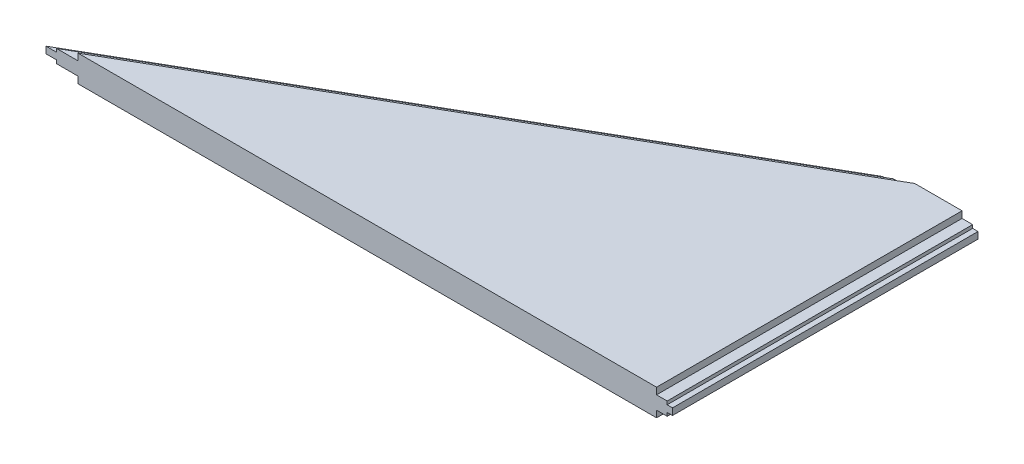
ISO-10303-21;
HEADER;
FILE_DESCRIPTION(('STEP AP214'),'2;1');
FILE_NAME('part.step','',(''),(''),'','','');
FILE_SCHEMA(('AUTOMOTIVE_DESIGN { 1 0 10303 214 1 1 1 1 }'));
ENDSEC;
DATA;
#1=APPLICATION_CONTEXT('core data for automotive mechanical design processes');
#2=APPLICATION_PROTOCOL_DEFINITION('international standard','automotive_design',2000,#1);
#3=PRODUCT_CONTEXT('',#1,'mechanical');
#4=PRODUCT('Part','Part','',(#3));
#5=PRODUCT_RELATED_PRODUCT_CATEGORY('part','',(#4));
#6=PRODUCT_DEFINITION_FORMATION('','',#4);
#7=PRODUCT_DEFINITION_CONTEXT('part definition',#1,'design');
#8=PRODUCT_DEFINITION('design','',#6,#7);
#9=PRODUCT_DEFINITION_SHAPE('','',#8);
#10=(LENGTH_UNIT() NAMED_UNIT(*) SI_UNIT(.MILLI.,.METRE.));
#11=(NAMED_UNIT(*) PLANE_ANGLE_UNIT() SI_UNIT($,.RADIAN.));
#12=(NAMED_UNIT(*) SI_UNIT($,.STERADIAN.) SOLID_ANGLE_UNIT());
#13=UNCERTAINTY_MEASURE_WITH_UNIT(LENGTH_MEASURE(1.E-05),#10,'distance_accuracy_value','');
#14=(GEOMETRIC_REPRESENTATION_CONTEXT(3) GLOBAL_UNCERTAINTY_ASSIGNED_CONTEXT((#13)) GLOBAL_UNIT_ASSIGNED_CONTEXT((#10,
#11,#12)) REPRESENTATION_CONTEXT('',''));
#15=CARTESIAN_POINT('',(0.,0.,0.));
#16=DIRECTION('',(0.,0.,1.));
#17=DIRECTION('',(1.,0.,0.));
#18=AXIS2_PLACEMENT_3D('',#15,#16,#17);
#19=CARTESIAN_POINT('',(0.,-6.35,-146.05));
#20=DIRECTION('',(0.,0.,-1.));
#21=DIRECTION('',(-1.,0.,0.));
#22=AXIS2_PLACEMENT_3D('',#19,#20,#21);
#23=PLANE('',#22);
#24=DIRECTION('',(1.,0.,0.));
#25=VECTOR('',#24,1.);
#26=CARTESIAN_POINT('',(0.,3.175,-146.05));
#27=LINE('',#26,#25);
#28=CARTESIAN_POINT('',(-75.9662846936071,3.175,-146.05));
#29=VERTEX_POINT('',#28);
#30=CARTESIAN_POINT('',(-65.7751226527548,3.175,-146.05));
#31=VERTEX_POINT('',#30);
#32=EDGE_CURVE('E236',#29,#31,#27,.T.);
#33=ORIENTED_EDGE('',*,*,#32,.T.);
#34=DIRECTION('',(0.,1.,0.));
#35=VECTOR('',#34,1.);
#36=CARTESIAN_POINT('',(-65.7751226527547,-6.35,-146.05));
#37=LINE('',#36,#35);
#38=CARTESIAN_POINT('',(-65.7751226527547,6.35,-146.05));
#39=VERTEX_POINT('',#38);
#40=EDGE_CURVE('E198',#31,#39,#37,.T.);
#41=ORIENTED_EDGE('',*,*,#40,.T.);
#42=DIRECTION('',(-1.,0.,0.));
#43=VECTOR('',#42,1.);
#44=CARTESIAN_POINT('',(0.,6.35,-146.05));
#45=LINE('',#44,#43);
#46=CARTESIAN_POINT('',(-43.18,6.35,-146.05));
#47=VERTEX_POINT('',#46);
#48=EDGE_CURVE('E338',#47,#39,#45,.T.);
#49=ORIENTED_EDGE('',*,*,#48,.F.);
#50=DIRECTION('',(0.,1.,0.));
#51=VECTOR('',#50,1.);
#52=CARTESIAN_POINT('',(-43.18,0.,-146.05));
#53=LINE('',#52,#51);
#54=CARTESIAN_POINT('',(-43.18,3.175,-146.05));
#55=VERTEX_POINT('',#54);
#56=EDGE_CURVE('E304',#55,#47,#53,.T.);
#57=ORIENTED_EDGE('',*,*,#56,.F.);
#58=DIRECTION('',(1.,0.,0.));
#59=VECTOR('',#58,1.);
#60=CARTESIAN_POINT('',(-38.1,3.175,-146.05));
#61=LINE('',#60,#59);
#62=CARTESIAN_POINT('',(-38.1,3.175,-146.05));
#63=VERTEX_POINT('',#62);
#64=EDGE_CURVE('E334',#55,#63,#61,.T.);
#65=ORIENTED_EDGE('',*,*,#64,.T.);
#66=DIRECTION('',(0.,1.,0.));
#67=VECTOR('',#66,1.);
#68=CARTESIAN_POINT('',(-38.1,-3.33066907387546E-13,-146.05));
#69=LINE('',#68,#67);
#70=CARTESIAN_POINT('',(-38.1,1.5875,-146.05));
#71=VERTEX_POINT('',#70);
#72=EDGE_CURVE('E271',#71,#63,#69,.T.);
#73=ORIENTED_EDGE('',*,*,#72,.F.);
#74=DIRECTION('',(-1.,0.,0.));
#75=VECTOR('',#74,1.);
#76=CARTESIAN_POINT('',(0.,1.5875,-146.05));
#77=LINE('',#76,#75);
#78=CARTESIAN_POINT('',(-35.56,1.5875,-146.05));
#79=VERTEX_POINT('',#78);
#80=EDGE_CURVE('E267',#79,#71,#77,.T.);
#81=ORIENTED_EDGE('',*,*,#80,.F.);
#82=DIRECTION('',(0.,1.,0.));
#83=VECTOR('',#82,1.);
#84=CARTESIAN_POINT('',(-35.56,0.,-146.05));
#85=LINE('',#84,#83);
#86=CARTESIAN_POINT('',(-35.56,-1.5875,-146.05));
#87=VERTEX_POINT('',#86);
#88=EDGE_CURVE('E282',#87,#79,#85,.T.);
#89=ORIENTED_EDGE('',*,*,#88,.F.);
#90=DIRECTION('',(1.,0.,0.));
#91=VECTOR('',#90,1.);
#92=CARTESIAN_POINT('',(0.,-1.58750000000001,-146.05));
#93=LINE('',#92,#91);
#94=CARTESIAN_POINT('',(-38.1,-1.5875,-146.05));
#95=VERTEX_POINT('',#94);
#96=EDGE_CURVE('E278',#95,#87,#93,.T.);
#97=ORIENTED_EDGE('',*,*,#96,.F.);
#98=DIRECTION('',(0.,1.,0.));
#99=VECTOR('',#98,1.);
#100=CARTESIAN_POINT('',(-38.1,3.33066907387546E-13,-146.05));
#101=LINE('',#100,#99);
#102=CARTESIAN_POINT('',(-38.1,-3.175,-146.05));
#103=VERTEX_POINT('',#102);
#104=EDGE_CURVE('E274',#103,#95,#101,.T.);
#105=ORIENTED_EDGE('',*,*,#104,.F.);
#106=DIRECTION('',(1.,0.,0.));
#107=VECTOR('',#106,1.);
#108=CARTESIAN_POINT('',(-38.1,-3.175,-146.05));
#109=LINE('',#108,#107);
#110=CARTESIAN_POINT('',(-43.18,-3.175,-146.05));
#111=VERTEX_POINT('',#110);
#112=EDGE_CURVE('E343',#111,#103,#109,.T.);
#113=ORIENTED_EDGE('',*,*,#112,.F.);
#114=DIRECTION('',(0.,-1.,0.));
#115=VECTOR('',#114,1.);
#116=CARTESIAN_POINT('',(-43.18,0.,-146.05));
#117=LINE('',#116,#115);
#118=CARTESIAN_POINT('',(-43.18,-6.35,-146.05));
#119=VERTEX_POINT('',#118);
#120=EDGE_CURVE('E303',#111,#119,#117,.T.);
#121=ORIENTED_EDGE('',*,*,#120,.T.);
#122=DIRECTION('',(-1.,0.,0.));
#123=VECTOR('',#122,1.);
#124=CARTESIAN_POINT('',(0.,-6.35,-146.05));
#125=LINE('',#124,#123);
#126=CARTESIAN_POINT('',(-65.7751226527547,-6.35,-146.05));
#127=VERTEX_POINT('',#126);
#128=EDGE_CURVE('E356',#119,#127,#125,.T.);
#129=ORIENTED_EDGE('',*,*,#128,.T.);
#130=DIRECTION('',(0.,-1.,0.));
#131=VECTOR('',#130,1.);
#132=CARTESIAN_POINT('',(-65.7751226527547,-6.35,-146.05));
#133=LINE('',#132,#131);
#134=CARTESIAN_POINT('',(-65.7751226527545,-3.175,-146.05));
#135=VERTEX_POINT('',#134);
#136=EDGE_CURVE('E197',#135,#127,#133,.T.);
#137=ORIENTED_EDGE('',*,*,#136,.F.);
#138=DIRECTION('',(1.,0.,0.));
#139=VECTOR('',#138,1.);
#140=CARTESIAN_POINT('',(0.,-3.175,-146.05));
#141=LINE('',#140,#139);
#142=CARTESIAN_POINT('',(-75.9662846936072,-3.175,-146.05));
#143=VERTEX_POINT('',#142);
#144=EDGE_CURVE('E206',#143,#135,#141,.T.);
#145=ORIENTED_EDGE('',*,*,#144,.F.);
#146=DIRECTION('',(0.,1.,0.));
#147=VECTOR('',#146,1.);
#148=CARTESIAN_POINT('',(-75.9662846936071,-6.35,-146.05));
#149=LINE('',#148,#147);
#150=CARTESIAN_POINT('',(-75.9662846936073,-1.5875,-146.05));
#151=VERTEX_POINT('',#150);
#152=EDGE_CURVE('E228',#143,#151,#149,.T.);
#153=ORIENTED_EDGE('',*,*,#152,.T.);
#154=DIRECTION('',(-1.,0.,0.));
#155=VECTOR('',#154,1.);
#156=CARTESIAN_POINT('',(0.,-1.58749999999999,-146.05));
#157=LINE('',#156,#155);
#158=CARTESIAN_POINT('',(-81.0618657140334,-1.5875,-146.05));
#159=VERTEX_POINT('',#158);
#160=EDGE_CURVE('E259',#151,#159,#157,.T.);
#161=ORIENTED_EDGE('',*,*,#160,.T.);
#162=DIRECTION('',(0.,1.,0.));
#163=VECTOR('',#162,1.);
#164=CARTESIAN_POINT('',(-81.0618657140334,-6.35,-146.05));
#165=LINE('',#164,#163);
#166=CARTESIAN_POINT('',(-81.0618657140334,1.5875,-146.05));
#167=VERTEX_POINT('',#166);
#168=EDGE_CURVE('E255',#159,#167,#165,.T.);
#169=ORIENTED_EDGE('',*,*,#168,.T.);
#170=DIRECTION('',(1.,0.,0.));
#171=VECTOR('',#170,1.);
#172=CARTESIAN_POINT('',(0.,1.5875,-146.05));
#173=LINE('',#172,#171);
#174=CARTESIAN_POINT('',(-75.9662846936072,1.5875,-146.05));
#175=VERTEX_POINT('',#174);
#176=EDGE_CURVE('E263',#167,#175,#173,.T.);
#177=ORIENTED_EDGE('',*,*,#176,.T.);
#178=DIRECTION('',(0.,1.,0.));
#179=VECTOR('',#178,1.);
#180=CARTESIAN_POINT('',(-75.9662846936071,-6.35,-146.05));
#181=LINE('',#180,#179);
#182=EDGE_CURVE('E244',#175,#29,#181,.T.);
#183=ORIENTED_EDGE('',*,*,#182,.T.);
#184=EDGE_LOOP('',(#33,#41,#49,#57,#65,#73,#81,#89,#97,#105,#113,#121,#129,#137,#145,#153,#161,
#169,#177,#183));
#185=FACE_BOUND('',#184,.T.);
#186=ADVANCED_FACE('F47',(#185),#23,.T.);
#187=CARTESIAN_POINT('',(-406.4,-6.35,0.));
#188=DIRECTION('',(0.,0.,1.));
#189=DIRECTION('',(1.,0.,0.));
#190=AXIS2_PLACEMENT_3D('',#187,#188,#189);
#191=PLANE('',#190);
#192=DIRECTION('',(1.,0.,0.));
#193=VECTOR('',#192,1.);
#194=CARTESIAN_POINT('',(-406.4,6.35,0.));
#195=LINE('',#194,#193);
#196=CARTESIAN_POINT('',(-319.775122652755,6.35,0.));
#197=VERTEX_POINT('',#196);
#198=CARTESIAN_POINT('',(-43.18,6.35,0.));
#199=VERTEX_POINT('',#198);
#200=EDGE_CURVE('E353',#197,#199,#195,.T.);
#201=ORIENTED_EDGE('',*,*,#200,.F.);
#202=DIRECTION('',(0.,-1.,0.));
#203=VECTOR('',#202,1.);
#204=CARTESIAN_POINT('',(-319.775122652755,-6.35,0.));
#205=LINE('',#204,#203);
#206=CARTESIAN_POINT('',(-319.775122652755,3.175,0.));
#207=VERTEX_POINT('',#206);
#208=EDGE_CURVE('E62',#197,#207,#205,.T.);
#209=ORIENTED_EDGE('',*,*,#208,.T.);
#210=DIRECTION('',(-1.,0.,0.));
#211=VECTOR('',#210,1.);
#212=CARTESIAN_POINT('',(-406.4,3.175,0.));
#213=LINE('',#212,#211);
#214=CARTESIAN_POINT('',(-329.966284693607,3.175,0.));
#215=VERTEX_POINT('',#214);
#216=EDGE_CURVE('E232',#207,#215,#213,.T.);
#217=ORIENTED_EDGE('',*,*,#216,.T.);
#218=DIRECTION('',(0.,-1.,0.));
#219=VECTOR('',#218,1.);
#220=CARTESIAN_POINT('',(-329.966284693607,-6.35,0.));
#221=LINE('',#220,#219);
#222=CARTESIAN_POINT('',(-329.966284693607,1.5875,0.));
#223=VERTEX_POINT('',#222);
#224=EDGE_CURVE('E240',#215,#223,#221,.T.);
#225=ORIENTED_EDGE('',*,*,#224,.T.);
#226=DIRECTION('',(-1.,0.,0.));
#227=VECTOR('',#226,1.);
#228=CARTESIAN_POINT('',(-406.4,1.5875,0.));
#229=LINE('',#228,#227);
#230=CARTESIAN_POINT('',(-335.061865714034,1.5875,0.));
#231=VERTEX_POINT('',#230);
#232=EDGE_CURVE('E11',#223,#231,#229,.T.);
#233=ORIENTED_EDGE('',*,*,#232,.T.);
#234=DIRECTION('',(0.,-1.,0.));
#235=VECTOR('',#234,1.);
#236=CARTESIAN_POINT('',(-335.061865714034,-6.35,0.));
#237=LINE('',#236,#235);
#238=CARTESIAN_POINT('',(-335.061865714034,-1.5875,0.));
#239=VERTEX_POINT('',#238);
#240=EDGE_CURVE('E379',#231,#239,#237,.T.);
#241=ORIENTED_EDGE('',*,*,#240,.T.);
#242=DIRECTION('',(1.,0.,0.));
#243=VECTOR('',#242,1.);
#244=CARTESIAN_POINT('',(-406.4,-1.58750000000001,0.));
#245=LINE('',#244,#243);
#246=CARTESIAN_POINT('',(-329.966284693607,-1.5875,0.));
#247=VERTEX_POINT('',#246);
#248=EDGE_CURVE('E55',#239,#247,#245,.T.);
#249=ORIENTED_EDGE('',*,*,#248,.T.);
#250=DIRECTION('',(0.,-1.,0.));
#251=VECTOR('',#250,1.);
#252=CARTESIAN_POINT('',(-329.966284693607,-6.35,0.));
#253=LINE('',#252,#251);
#254=CARTESIAN_POINT('',(-329.966284693607,-3.175,0.));
#255=VERTEX_POINT('',#254);
#256=EDGE_CURVE('E214',#247,#255,#253,.T.);
#257=ORIENTED_EDGE('',*,*,#256,.T.);
#258=DIRECTION('',(-1.,0.,0.));
#259=VECTOR('',#258,1.);
#260=CARTESIAN_POINT('',(-406.4,-3.175,0.));
#261=LINE('',#260,#259);
#262=CARTESIAN_POINT('',(-319.775122652755,-3.175,0.));
#263=VERTEX_POINT('',#262);
#264=EDGE_CURVE('E203',#263,#255,#261,.T.);
#265=ORIENTED_EDGE('',*,*,#264,.F.);
#266=DIRECTION('',(0.,1.,0.));
#267=VECTOR('',#266,1.);
#268=CARTESIAN_POINT('',(-319.775122652755,-6.35,0.));
#269=LINE('',#268,#267);
#270=CARTESIAN_POINT('',(-319.775122652755,-6.35,0.));
#271=VERTEX_POINT('',#270);
#272=EDGE_CURVE('E186',#271,#263,#269,.T.);
#273=ORIENTED_EDGE('',*,*,#272,.F.);
#274=DIRECTION('',(1.,0.,0.));
#275=VECTOR('',#274,1.);
#276=CARTESIAN_POINT('',(-406.4,-6.35,0.));
#277=LINE('',#276,#275);
#278=CARTESIAN_POINT('',(-43.18,-6.35,0.));
#279=VERTEX_POINT('',#278);
#280=EDGE_CURVE('E360',#271,#279,#277,.T.);
#281=ORIENTED_EDGE('',*,*,#280,.T.);
#282=DIRECTION('',(0.,1.,0.));
#283=VECTOR('',#282,1.);
#284=CARTESIAN_POINT('',(-43.1799999999999,-6.35,0.));
#285=LINE('',#284,#283);
#286=CARTESIAN_POINT('',(-43.18,-3.175,0.));
#287=VERTEX_POINT('',#286);
#288=EDGE_CURVE('E329',#279,#287,#285,.T.);
#289=ORIENTED_EDGE('',*,*,#288,.T.);
#290=DIRECTION('',(1.,0.,0.));
#291=VECTOR('',#290,1.);
#292=CARTESIAN_POINT('',(-38.1,-3.175,0.));
#293=LINE('',#292,#291);
#294=CARTESIAN_POINT('',(-38.1,-3.175,0.));
#295=VERTEX_POINT('',#294);
#296=EDGE_CURVE('E333',#287,#295,#293,.T.);
#297=ORIENTED_EDGE('',*,*,#296,.T.);
#298=DIRECTION('',(0.,-1.,0.));
#299=VECTOR('',#298,1.);
#300=CARTESIAN_POINT('',(-38.1,-6.35000000000322,0.));
#301=LINE('',#300,#299);
#302=CARTESIAN_POINT('',(-38.0999999999999,-1.5875,0.));
#303=VERTEX_POINT('',#302);
#304=EDGE_CURVE('E70',#303,#295,#301,.T.);
#305=ORIENTED_EDGE('',*,*,#304,.F.);
#306=DIRECTION('',(-1.,0.,0.));
#307=VECTOR('',#306,1.);
#308=CARTESIAN_POINT('',(-406.4,-1.58749999999994,0.));
#309=LINE('',#308,#307);
#310=CARTESIAN_POINT('',(-35.5599999999999,-1.5875,0.));
#311=VERTEX_POINT('',#310);
#312=EDGE_CURVE('E376',#311,#303,#309,.T.);
#313=ORIENTED_EDGE('',*,*,#312,.F.);
#314=DIRECTION('',(0.,-1.,0.));
#315=VECTOR('',#314,1.);
#316=CARTESIAN_POINT('',(-35.5599999999999,-6.35,0.));
#317=LINE('',#316,#315);
#318=CARTESIAN_POINT('',(-35.5599999999999,1.5875,0.));
#319=VERTEX_POINT('',#318);
#320=EDGE_CURVE('E373',#319,#311,#317,.T.);
#321=ORIENTED_EDGE('',*,*,#320,.F.);
#322=DIRECTION('',(1.,0.,0.));
#323=VECTOR('',#322,1.);
#324=CARTESIAN_POINT('',(-406.4,1.5875,0.));
#325=LINE('',#324,#323);
#326=CARTESIAN_POINT('',(-38.0999999999999,1.5875,0.));
#327=VERTEX_POINT('',#326);
#328=EDGE_CURVE('E370',#327,#319,#325,.T.);
#329=ORIENTED_EDGE('',*,*,#328,.F.);
#330=DIRECTION('',(0.,-1.,0.));
#331=VECTOR('',#330,1.);
#332=CARTESIAN_POINT('',(-38.0999999999999,-6.34999999999678,0.));
#333=LINE('',#332,#331);
#334=CARTESIAN_POINT('',(-38.1,3.175,0.));
#335=VERTEX_POINT('',#334);
#336=EDGE_CURVE('E300',#335,#327,#333,.T.);
#337=ORIENTED_EDGE('',*,*,#336,.F.);
#338=DIRECTION('',(1.,0.,0.));
#339=VECTOR('',#338,1.);
#340=CARTESIAN_POINT('',(-38.1,3.175,0.));
#341=LINE('',#340,#339);
#342=CARTESIAN_POINT('',(-43.18,3.175,0.));
#343=VERTEX_POINT('',#342);
#344=EDGE_CURVE('E339',#343,#335,#341,.T.);
#345=ORIENTED_EDGE('',*,*,#344,.F.);
#346=DIRECTION('',(0.,-1.,0.));
#347=VECTOR('',#346,1.);
#348=CARTESIAN_POINT('',(-43.1799999999999,-6.35,0.));
#349=LINE('',#348,#347);
#350=EDGE_CURVE('E313',#199,#343,#349,.T.);
#351=ORIENTED_EDGE('',*,*,#350,.F.);
#352=EDGE_LOOP('',(#201,#209,#217,#225,#233,#241,#249,#257,#265,#273,#281,#289,#297,#305,#313,
#321,#329,#337,#345,#351));
#353=FACE_BOUND('',#352,.T.);
#354=ADVANCED_FACE('F212',(#353),#191,.T.);
#355=CARTESIAN_POINT('',(0.,6.35,0.));
#356=DIRECTION('',(0.,-1.,0.));
#357=DIRECTION('',(0.,0.,-1.));
#358=AXIS2_PLACEMENT_3D('',#355,#356,#357);
#359=PLANE('',#358);
#360=DIRECTION('',(0.866906303057535,0.,-0.498471124258082));
#361=VECTOR('',#360,1.);
#362=CARTESIAN_POINT('',(-424.945372258804,6.35,60.4728935234783));
#363=LINE('',#362,#361);
#364=EDGE_CURVE('E407',#197,#39,#363,.T.);
#365=ORIENTED_EDGE('',*,*,#364,.F.);
#366=ORIENTED_EDGE('',*,*,#200,.T.);
#367=DIRECTION('',(0.,0.,-1.));
#368=VECTOR('',#367,1.);
#369=CARTESIAN_POINT('',(-43.1799999999999,6.35,11.0490000000001));
#370=LINE('',#369,#368);
#371=EDGE_CURVE('E309',#199,#47,#370,.T.);
#372=ORIENTED_EDGE('',*,*,#371,.T.);
#373=ORIENTED_EDGE('',*,*,#48,.T.);
#374=EDGE_LOOP('',(#365,#366,#372,#373));
#375=FACE_BOUND('',#374,.T.);
#376=ADVANCED_FACE('F428',(#375),#359,.F.);
#377=CARTESIAN_POINT('',(0.,-6.35,0.));
#378=DIRECTION('',(0.,-1.,0.));
#379=DIRECTION('',(0.,0.,-1.));
#380=AXIS2_PLACEMENT_3D('',#377,#378,#379);
#381=PLANE('',#380);
#382=DIRECTION('',(0.866906303057535,0.,-0.498471124258082));
#383=VECTOR('',#382,1.);
#384=CARTESIAN_POINT('',(-424.945372258804,-6.35,60.4728935234783));
#385=LINE('',#384,#383);
#386=EDGE_CURVE('E192',#271,#127,#385,.T.);
#387=ORIENTED_EDGE('',*,*,#386,.T.);
#388=ORIENTED_EDGE('',*,*,#128,.F.);
#389=DIRECTION('',(0.,0.,-1.));
#390=VECTOR('',#389,1.);
#391=CARTESIAN_POINT('',(-43.1799999999999,-6.35,11.0490000000001));
#392=LINE('',#391,#390);
#393=EDGE_CURVE('E308',#279,#119,#392,.T.);
#394=ORIENTED_EDGE('',*,*,#393,.F.);
#395=ORIENTED_EDGE('',*,*,#280,.F.);
#396=EDGE_LOOP('',(#387,#388,#394,#395));
#397=FACE_BOUND('',#396,.T.);
#398=ADVANCED_FACE('F467',(#397),#381,.T.);
#399=CARTESIAN_POINT('',(-38.1,3.175,0.));
#400=DIRECTION('',(0.,-1.,0.));
#401=DIRECTION('',(0.,0.,-1.));
#402=AXIS2_PLACEMENT_3D('',#399,#400,#401);
#403=PLANE('',#402);
#404=ORIENTED_EDGE('',*,*,#344,.T.);
#405=DIRECTION('',(0.,0.,-1.));
#406=VECTOR('',#405,1.);
#407=CARTESIAN_POINT('',(-38.1,3.175,0.));
#408=LINE('',#407,#406);
#409=EDGE_CURVE('E366',#335,#63,#408,.T.);
#410=ORIENTED_EDGE('',*,*,#409,.T.);
#411=ORIENTED_EDGE('',*,*,#64,.F.);
#412=DIRECTION('',(0.,0.,-1.));
#413=VECTOR('',#412,1.);
#414=CARTESIAN_POINT('',(-43.1799999999999,3.175,11.0490000000001));
#415=LINE('',#414,#413);
#416=EDGE_CURVE('E307',#343,#55,#415,.T.);
#417=ORIENTED_EDGE('',*,*,#416,.F.);
#418=EDGE_LOOP('',(#404,#410,#411,#417));
#419=FACE_BOUND('',#418,.T.);
#420=ADVANCED_FACE('F437',(#419),#403,.F.);
#421=CARTESIAN_POINT('',(-38.1,-3.175,0.));
#422=DIRECTION('',(0.,1.,0.));
#423=DIRECTION('',(0.,0.,1.));
#424=AXIS2_PLACEMENT_3D('',#421,#422,#423);
#425=PLANE('',#424);
#426=ORIENTED_EDGE('',*,*,#112,.T.);
#427=DIRECTION('',(0.,0.,1.));
#428=VECTOR('',#427,1.);
#429=CARTESIAN_POINT('',(-38.1,-3.175,0.));
#430=LINE('',#429,#428);
#431=EDGE_CURVE('E363',#103,#295,#430,.T.);
#432=ORIENTED_EDGE('',*,*,#431,.T.);
#433=ORIENTED_EDGE('',*,*,#296,.F.);
#434=DIRECTION('',(0.,0.,-1.));
#435=VECTOR('',#434,1.);
#436=CARTESIAN_POINT('',(-43.1799999999999,-3.175,11.0490000000001));
#437=LINE('',#436,#435);
#438=EDGE_CURVE('E320',#287,#111,#437,.T.);
#439=ORIENTED_EDGE('',*,*,#438,.T.);
#440=EDGE_LOOP('',(#426,#432,#433,#439));
#441=FACE_BOUND('',#440,.T.);
#442=ADVANCED_FACE('F458',(#441),#425,.F.);
#443=CARTESIAN_POINT('',(-43.1799999999999,0.,11.0490000000001));
#444=DIRECTION('',(1.,0.,0.));
#445=DIRECTION('',(0.,0.,-1.));
#446=AXIS2_PLACEMENT_3D('',#443,#444,#445);
#447=PLANE('',#446);
#448=ORIENTED_EDGE('',*,*,#393,.T.);
#449=ORIENTED_EDGE('',*,*,#120,.F.);
#450=ORIENTED_EDGE('',*,*,#438,.F.);
#451=ORIENTED_EDGE('',*,*,#288,.F.);
#452=EDGE_LOOP('',(#448,#449,#450,#451));
#453=FACE_BOUND('',#452,.T.);
#454=ADVANCED_FACE('F463',(#453),#447,.T.);
#455=CARTESIAN_POINT('',(-43.1799999999999,0.,11.0490000000001));
#456=DIRECTION('',(-1.,0.,0.));
#457=DIRECTION('',(0.,0.,1.));
#458=AXIS2_PLACEMENT_3D('',#455,#456,#457);
#459=PLANE('',#458);
#460=ORIENTED_EDGE('',*,*,#350,.T.);
#461=ORIENTED_EDGE('',*,*,#416,.T.);
#462=ORIENTED_EDGE('',*,*,#56,.T.);
#463=ORIENTED_EDGE('',*,*,#371,.F.);
#464=EDGE_LOOP('',(#460,#461,#462,#463));
#465=FACE_BOUND('',#464,.T.);
#466=ADVANCED_FACE('F432',(#465),#459,.F.);
#467=CARTESIAN_POINT('',(0.,1.5875,11.0490000000001));
#468=DIRECTION('',(0.,-1.,0.));
#469=DIRECTION('',(0.,0.,-1.));
#470=AXIS2_PLACEMENT_3D('',#467,#468,#469);
#471=PLANE('',#470);
#472=ORIENTED_EDGE('',*,*,#328,.T.);
#473=DIRECTION('',(0.,0.,-1.));
#474=VECTOR('',#473,1.);
#475=CARTESIAN_POINT('',(-35.5599999999999,1.5875,11.0490000000001));
#476=LINE('',#475,#474);
#477=EDGE_CURVE('E287',#319,#79,#476,.T.);
#478=ORIENTED_EDGE('',*,*,#477,.T.);
#479=ORIENTED_EDGE('',*,*,#80,.T.);
#480=DIRECTION('',(0.,0.,-1.));
#481=VECTOR('',#480,1.);
#482=CARTESIAN_POINT('',(-38.0999999999999,1.5875,11.0490000000001));
#483=LINE('',#482,#481);
#484=EDGE_CURVE('E286',#327,#71,#483,.T.);
#485=ORIENTED_EDGE('',*,*,#484,.F.);
#486=EDGE_LOOP('',(#472,#478,#479,#485));
#487=FACE_BOUND('',#486,.T.);
#488=ADVANCED_FACE('F445',(#487),#471,.F.);
#489=CARTESIAN_POINT('',(-35.5599999999999,0.,11.0490000000001));
#490=DIRECTION('',(-1.,0.,0.));
#491=DIRECTION('',(0.,0.,1.));
#492=AXIS2_PLACEMENT_3D('',#489,#490,#491);
#493=PLANE('',#492);
#494=ORIENTED_EDGE('',*,*,#320,.T.);
#495=DIRECTION('',(0.,0.,-1.));
#496=VECTOR('',#495,1.);
#497=CARTESIAN_POINT('',(-35.5599999999999,-1.5875,11.0490000000001));
#498=LINE('',#497,#496);
#499=EDGE_CURVE('E290',#311,#87,#498,.T.);
#500=ORIENTED_EDGE('',*,*,#499,.T.);
#501=ORIENTED_EDGE('',*,*,#88,.T.);
#502=ORIENTED_EDGE('',*,*,#477,.F.);
#503=EDGE_LOOP('',(#494,#500,#501,#502));
#504=FACE_BOUND('',#503,.T.);
#505=ADVANCED_FACE('F449',(#504),#493,.F.);
#506=CARTESIAN_POINT('',(0.,-1.58750000000001,11.0490000000001));
#507=DIRECTION('',(0.,1.,0.));
#508=DIRECTION('',(-1.,0.,0.));
#509=AXIS2_PLACEMENT_3D('',#506,#507,#508);
#510=PLANE('',#509);
#511=ORIENTED_EDGE('',*,*,#312,.T.);
#512=DIRECTION('',(0.,0.,-1.));
#513=VECTOR('',#512,1.);
#514=CARTESIAN_POINT('',(-38.0999999999999,-1.5875,11.0490000000001));
#515=LINE('',#514,#513);
#516=EDGE_CURVE('E293',#303,#95,#515,.T.);
#517=ORIENTED_EDGE('',*,*,#516,.T.);
#518=ORIENTED_EDGE('',*,*,#96,.T.);
#519=ORIENTED_EDGE('',*,*,#499,.F.);
#520=EDGE_LOOP('',(#511,#517,#518,#519));
#521=FACE_BOUND('',#520,.T.);
#522=ADVANCED_FACE('F454',(#521),#510,.F.);
#523=CARTESIAN_POINT('',(-38.0999999999999,3.33066907387546E-13,11.0490000000001));
#524=DIRECTION('',(-1.,0.,0.));
#525=DIRECTION('',(0.,-1.,0.));
#526=AXIS2_PLACEMENT_3D('',#523,#524,#525);
#527=PLANE('',#526);
#528=ORIENTED_EDGE('',*,*,#304,.T.);
#529=ORIENTED_EDGE('',*,*,#431,.F.);
#530=ORIENTED_EDGE('',*,*,#104,.T.);
#531=ORIENTED_EDGE('',*,*,#516,.F.);
#532=EDGE_LOOP('',(#528,#529,#530,#531));
#533=FACE_BOUND('',#532,.T.);
#534=ADVANCED_FACE('F456',(#533),#527,.F.);
#535=CARTESIAN_POINT('',(-38.0999999999999,-3.33066907387546E-13,11.0490000000001));
#536=DIRECTION('',(-1.,0.,0.));
#537=DIRECTION('',(0.,-1.,0.));
#538=AXIS2_PLACEMENT_3D('',#535,#536,#537);
#539=PLANE('',#538);
#540=ORIENTED_EDGE('',*,*,#336,.T.);
#541=ORIENTED_EDGE('',*,*,#484,.T.);
#542=ORIENTED_EDGE('',*,*,#72,.T.);
#543=ORIENTED_EDGE('',*,*,#409,.F.);
#544=EDGE_LOOP('',(#540,#541,#542,#543));
#545=FACE_BOUND('',#544,.T.);
#546=ADVANCED_FACE('F442',(#545),#539,.F.);
#547=CARTESIAN_POINT('',(-345.489740561619,1.58750000000001,198.656600822931));
#548=DIRECTION('',(0.,1.,0.));
#549=DIRECTION('',(0.,0.,1.));
#550=AXIS2_PLACEMENT_3D('',#547,#548,#549);
#551=PLANE('',#550);
#552=DIRECTION('',(0.866906303057535,0.,-0.498471124258082));
#553=VECTOR('',#552,1.);
#554=CARTESIAN_POINT('',(-428.743722225651,1.5875,53.8670674941799));
#555=LINE('',#554,#553);
#556=EDGE_CURVE('E396',#231,#167,#555,.T.);
#557=ORIENTED_EDGE('',*,*,#556,.F.);
#558=ORIENTED_EDGE('',*,*,#232,.F.);
#559=DIRECTION('',(0.866906303057535,0.,-0.498471124258082));
#560=VECTOR('',#559,1.);
#561=CARTESIAN_POINT('',(-427.477605570035,1.5875,56.069009503946));
#562=LINE('',#561,#560);
#563=EDGE_CURVE('E216',#223,#175,#562,.T.);
#564=ORIENTED_EDGE('',*,*,#563,.T.);
#565=ORIENTED_EDGE('',*,*,#176,.F.);
#566=EDGE_LOOP('',(#557,#558,#564,#565));
#567=FACE_BOUND('',#566,.T.);
#568=ADVANCED_FACE('F422',(#567),#551,.T.);
#569=CARTESIAN_POINT('',(-427.477605570035,0.,56.069009503946));
#570=DIRECTION('',(-0.498471124258082,0.,-0.866906303057535));
#571=DIRECTION('',(-0.866906303057535,0.,0.498471124258082));
#572=AXIS2_PLACEMENT_3D('',#569,#570,#571);
#573=PLANE('',#572);
#574=ORIENTED_EDGE('',*,*,#563,.F.);
#575=ORIENTED_EDGE('',*,*,#224,.F.);
#576=DIRECTION('',(0.866906303057535,0.,-0.498471124258082));
#577=VECTOR('',#576,1.);
#578=CARTESIAN_POINT('',(-427.477605570035,3.175,56.069009503946));
#579=LINE('',#578,#577);
#580=EDGE_CURVE('E222',#215,#29,#579,.T.);
#581=ORIENTED_EDGE('',*,*,#580,.T.);
#582=ORIENTED_EDGE('',*,*,#182,.F.);
#583=EDGE_LOOP('',(#574,#575,#581,#582));
#584=FACE_BOUND('',#583,.T.);
#585=ADVANCED_FACE('F418',(#584),#573,.T.);
#586=CARTESIAN_POINT('',(-345.489740561619,3.175,198.656600822931));
#587=DIRECTION('',(0.,1.,0.));
#588=DIRECTION('',(0.,0.,1.));
#589=AXIS2_PLACEMENT_3D('',#586,#587,#588);
#590=PLANE('',#589);
#591=ORIENTED_EDGE('',*,*,#580,.F.);
#592=ORIENTED_EDGE('',*,*,#216,.F.);
#593=DIRECTION('',(0.866906303057535,0.,-0.498471124258082));
#594=VECTOR('',#593,1.);
#595=CARTESIAN_POINT('',(-424.945372258804,3.175,60.4728935234783));
#596=LINE('',#595,#594);
#597=EDGE_CURVE('E410',#207,#31,#596,.T.);
#598=ORIENTED_EDGE('',*,*,#597,.T.);
#599=ORIENTED_EDGE('',*,*,#32,.F.);
#600=EDGE_LOOP('',(#591,#592,#598,#599));
#601=FACE_BOUND('',#600,.T.);
#602=ADVANCED_FACE('F423',(#601),#590,.T.);
#603=CARTESIAN_POINT('',(-424.945372258804,0.,60.4728935234783));
#604=DIRECTION('',(-0.498471124258082,0.,-0.866906303057535));
#605=DIRECTION('',(-0.866906303057535,0.,0.498471124258082));
#606=AXIS2_PLACEMENT_3D('',#603,#604,#605);
#607=PLANE('',#606);
#608=ORIENTED_EDGE('',*,*,#597,.F.);
#609=ORIENTED_EDGE('',*,*,#208,.F.);
#610=ORIENTED_EDGE('',*,*,#364,.T.);
#611=ORIENTED_EDGE('',*,*,#40,.F.);
#612=EDGE_LOOP('',(#608,#609,#610,#611));
#613=FACE_BOUND('',#612,.T.);
#614=ADVANCED_FACE('F424',(#613),#607,.T.);
#615=CARTESIAN_POINT('',(-424.945372258804,0.,60.4728935234783));
#616=DIRECTION('',(0.498471124258082,0.,0.866906303057535));
#617=DIRECTION('',(0.866906303057535,0.,-0.498471124258082));
#618=AXIS2_PLACEMENT_3D('',#615,#616,#617);
#619=PLANE('',#618);
#620=ORIENTED_EDGE('',*,*,#136,.T.);
#621=ORIENTED_EDGE('',*,*,#386,.F.);
#622=ORIENTED_EDGE('',*,*,#272,.T.);
#623=DIRECTION('',(0.866906303057535,0.,-0.498471124258082));
#624=VECTOR('',#623,1.);
#625=CARTESIAN_POINT('',(-424.945372258804,-3.175,60.4728935234783));
#626=LINE('',#625,#624);
#627=EDGE_CURVE('E189',#263,#135,#626,.T.);
#628=ORIENTED_EDGE('',*,*,#627,.T.);
#629=EDGE_LOOP('',(#620,#621,#622,#628));
#630=FACE_BOUND('',#629,.T.);
#631=ADVANCED_FACE('F188',(#630),#619,.F.);
#632=CARTESIAN_POINT('',(-345.489740561619,-3.17500000000001,198.656600822931));
#633=DIRECTION('',(0.,1.,0.));
#634=DIRECTION('',(0.,0.,1.));
#635=AXIS2_PLACEMENT_3D('',#632,#633,#634);
#636=PLANE('',#635);
#637=ORIENTED_EDGE('',*,*,#144,.T.);
#638=ORIENTED_EDGE('',*,*,#627,.F.);
#639=ORIENTED_EDGE('',*,*,#264,.T.);
#640=DIRECTION('',(0.866906303057535,0.,-0.498471124258082));
#641=VECTOR('',#640,1.);
#642=CARTESIAN_POINT('',(-427.477605570035,-3.175,56.069009503946));
#643=LINE('',#642,#641);
#644=EDGE_CURVE('E208',#255,#143,#643,.T.);
#645=ORIENTED_EDGE('',*,*,#644,.T.);
#646=EDGE_LOOP('',(#637,#638,#639,#645));
#647=FACE_BOUND('',#646,.T.);
#648=ADVANCED_FACE('F201',(#647),#636,.F.);
#649=CARTESIAN_POINT('',(-427.477605570035,0.,56.069009503946));
#650=DIRECTION('',(-0.498471124258082,0.,-0.866906303057535));
#651=DIRECTION('',(-0.866906303057535,0.,0.498471124258082));
#652=AXIS2_PLACEMENT_3D('',#649,#650,#651);
#653=PLANE('',#652);
#654=ORIENTED_EDGE('',*,*,#644,.F.);
#655=ORIENTED_EDGE('',*,*,#256,.F.);
#656=DIRECTION('',(0.866906303057535,0.,-0.498471124258082));
#657=VECTOR('',#656,1.);
#658=CARTESIAN_POINT('',(-427.477605570035,-1.5875,56.069009503946));
#659=LINE('',#658,#657);
#660=EDGE_CURVE('E390',#247,#151,#659,.T.);
#661=ORIENTED_EDGE('',*,*,#660,.T.);
#662=ORIENTED_EDGE('',*,*,#152,.F.);
#663=EDGE_LOOP('',(#654,#655,#661,#662));
#664=FACE_BOUND('',#663,.T.);
#665=ADVANCED_FACE('F469',(#664),#653,.T.);
#666=CARTESIAN_POINT('',(-345.489740561619,-1.58749999999997,198.656600822931));
#667=DIRECTION('',(0.,-1.,0.));
#668=DIRECTION('',(0.,0.,-1.));
#669=AXIS2_PLACEMENT_3D('',#666,#667,#668);
#670=PLANE('',#669);
#671=ORIENTED_EDGE('',*,*,#660,.F.);
#672=ORIENTED_EDGE('',*,*,#248,.F.);
#673=DIRECTION('',(0.866906303057535,0.,-0.498471124258082));
#674=VECTOR('',#673,1.);
#675=CARTESIAN_POINT('',(-428.743722225651,-1.5875,53.8670674941799));
#676=LINE('',#675,#674);
#677=EDGE_CURVE('E388',#239,#159,#676,.T.);
#678=ORIENTED_EDGE('',*,*,#677,.T.);
#679=ORIENTED_EDGE('',*,*,#160,.F.);
#680=EDGE_LOOP('',(#671,#672,#678,#679));
#681=FACE_BOUND('',#680,.T.);
#682=ADVANCED_FACE('F387',(#681),#670,.T.);
#683=CARTESIAN_POINT('',(-428.743722225651,0.,53.8670674941799));
#684=DIRECTION('',(-0.498471124258082,0.,-0.866906303057535));
#685=DIRECTION('',(-0.866906303057535,0.,0.498471124258082));
#686=AXIS2_PLACEMENT_3D('',#683,#684,#685);
#687=PLANE('',#686);
#688=ORIENTED_EDGE('',*,*,#677,.F.);
#689=ORIENTED_EDGE('',*,*,#240,.F.);
#690=ORIENTED_EDGE('',*,*,#556,.T.);
#691=ORIENTED_EDGE('',*,*,#168,.F.);
#692=EDGE_LOOP('',(#688,#689,#690,#691));
#693=FACE_BOUND('',#692,.T.);
#694=ADVANCED_FACE('F392',(#693),#687,.T.);
#695=CLOSED_SHELL('',(#186,#354,#376,#398,#420,#442,#454,#466,#488,#505,#522,#534,#546,#568,
#585,#602,#614,#631,#648,#665,#682,#694));
#696=MANIFOLD_SOLID_BREP('B2',#695);
#697=ADVANCED_BREP_SHAPE_REPRESENTATION('',(#18,#696),#14);
#698=SHAPE_DEFINITION_REPRESENTATION(#9,#697);
ENDSEC;
END-ISO-10303-21;
